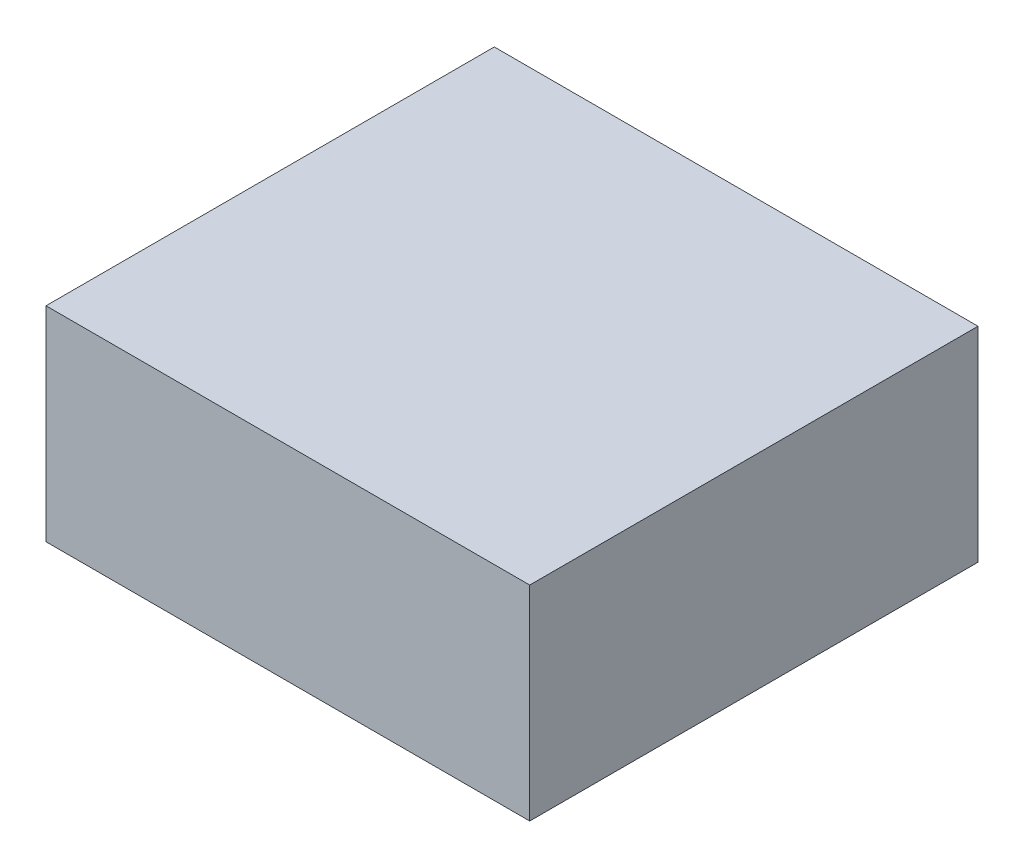
ISO-10303-21;
HEADER;
FILE_DESCRIPTION(('STEP AP214'),'2;1');
FILE_NAME('part.step','',(''),(''),'','','');
FILE_SCHEMA(('AUTOMOTIVE_DESIGN { 1 0 10303 214 1 1 1 1 }'));
ENDSEC;
DATA;
#1=APPLICATION_CONTEXT('core data for automotive mechanical design processes');
#2=APPLICATION_PROTOCOL_DEFINITION('international standard','automotive_design',2000,#1);
#3=PRODUCT_CONTEXT('',#1,'mechanical');
#4=PRODUCT('Part','Part','',(#3));
#5=PRODUCT_RELATED_PRODUCT_CATEGORY('part','',(#4));
#6=PRODUCT_DEFINITION_FORMATION('','',#4);
#7=PRODUCT_DEFINITION_CONTEXT('part definition',#1,'design');
#8=PRODUCT_DEFINITION('design','',#6,#7);
#9=PRODUCT_DEFINITION_SHAPE('','',#8);
#10=(LENGTH_UNIT() NAMED_UNIT(*) SI_UNIT(.MILLI.,.METRE.));
#11=(NAMED_UNIT(*) PLANE_ANGLE_UNIT() SI_UNIT($,.RADIAN.));
#12=(NAMED_UNIT(*) SI_UNIT($,.STERADIAN.) SOLID_ANGLE_UNIT());
#13=UNCERTAINTY_MEASURE_WITH_UNIT(LENGTH_MEASURE(1.E-05),#10,'distance_accuracy_value','');
#14=(GEOMETRIC_REPRESENTATION_CONTEXT(3) GLOBAL_UNCERTAINTY_ASSIGNED_CONTEXT((#13)) GLOBAL_UNIT_ASSIGNED_CONTEXT((#10,
#11,#12)) REPRESENTATION_CONTEXT('',''));
#15=CARTESIAN_POINT('',(0.,0.,0.));
#16=DIRECTION('',(0.,0.,1.));
#17=DIRECTION('',(1.,0.,0.));
#18=AXIS2_PLACEMENT_3D('',#15,#16,#17);
#19=CARTESIAN_POINT('',(0.,76.2,0.));
#20=DIRECTION('',(-1.,0.,0.));
#21=DIRECTION('',(0.,0.,1.));
#22=AXIS2_PLACEMENT_3D('',#19,#20,#21);
#23=PLANE('',#22);
#24=DIRECTION('',(0.,0.,-1.));
#25=VECTOR('',#24,1.);
#26=CARTESIAN_POINT('',(0.,0.,0.));
#27=LINE('',#26,#25);
#28=CARTESIAN_POINT('',(0.,0.,0.));
#29=VERTEX_POINT('',#28);
#30=CARTESIAN_POINT('',(0.,0.,-167.132));
#31=VERTEX_POINT('',#30);
#32=EDGE_CURVE('E97',#29,#31,#27,.T.);
#33=ORIENTED_EDGE('',*,*,#32,.T.);
#34=DIRECTION('',(0.,-1.,0.));
#35=VECTOR('',#34,1.);
#36=CARTESIAN_POINT('',(0.,76.2,-167.132));
#37=LINE('',#36,#35);
#38=CARTESIAN_POINT('',(0.,76.2,-167.132));
#39=VERTEX_POINT('',#38);
#40=EDGE_CURVE('E11',#39,#31,#37,.T.);
#41=ORIENTED_EDGE('',*,*,#40,.F.);
#42=DIRECTION('',(0.,0.,-1.));
#43=VECTOR('',#42,1.);
#44=CARTESIAN_POINT('',(0.,76.2,0.));
#45=LINE('',#44,#43);
#46=CARTESIAN_POINT('',(0.,76.2,0.));
#47=VERTEX_POINT('',#46);
#48=EDGE_CURVE('E85',#47,#39,#45,.T.);
#49=ORIENTED_EDGE('',*,*,#48,.F.);
#50=DIRECTION('',(0.,-1.,0.));
#51=VECTOR('',#50,1.);
#52=CARTESIAN_POINT('',(0.,76.2,0.));
#53=LINE('',#52,#51);
#54=EDGE_CURVE('E93',#47,#29,#53,.T.);
#55=ORIENTED_EDGE('',*,*,#54,.T.);
#56=EDGE_LOOP('',(#33,#41,#49,#55));
#57=FACE_BOUND('',#56,.T.);
#58=ADVANCED_FACE('F34',(#57),#23,.F.);
#59=CARTESIAN_POINT('',(0.,76.2,-167.132));
#60=DIRECTION('',(0.,0.,1.));
#61=DIRECTION('',(1.,0.,0.));
#62=AXIS2_PLACEMENT_3D('',#59,#60,#61);
#63=PLANE('',#62);
#64=DIRECTION('',(-1.,0.,0.));
#65=VECTOR('',#64,1.);
#66=CARTESIAN_POINT('',(0.,0.,-167.132));
#67=LINE('',#66,#65);
#68=CARTESIAN_POINT('',(-180.34,0.,-167.132));
#69=VERTEX_POINT('',#68);
#70=EDGE_CURVE('E89',#31,#69,#67,.T.);
#71=ORIENTED_EDGE('',*,*,#70,.T.);
#72=DIRECTION('',(0.,-1.,0.));
#73=VECTOR('',#72,1.);
#74=CARTESIAN_POINT('',(-180.34,76.2,-167.132));
#75=LINE('',#74,#73);
#76=CARTESIAN_POINT('',(-180.34,76.2,-167.132));
#77=VERTEX_POINT('',#76);
#78=EDGE_CURVE('E42',#77,#69,#75,.T.);
#79=ORIENTED_EDGE('',*,*,#78,.F.);
#80=DIRECTION('',(-1.,0.,0.));
#81=VECTOR('',#80,1.);
#82=CARTESIAN_POINT('',(0.,76.2,-167.132));
#83=LINE('',#82,#81);
#84=EDGE_CURVE('E80',#39,#77,#83,.T.);
#85=ORIENTED_EDGE('',*,*,#84,.F.);
#86=ORIENTED_EDGE('',*,*,#40,.T.);
#87=EDGE_LOOP('',(#71,#79,#85,#86));
#88=FACE_BOUND('',#87,.T.);
#89=ADVANCED_FACE('F88',(#88),#63,.F.);
#90=CARTESIAN_POINT('',(-180.34,76.2,0.));
#91=DIRECTION('',(1.,0.,0.));
#92=DIRECTION('',(0.,0.,-1.));
#93=AXIS2_PLACEMENT_3D('',#90,#91,#92);
#94=PLANE('',#93);
#95=DIRECTION('',(0.,0.,1.));
#96=VECTOR('',#95,1.);
#97=CARTESIAN_POINT('',(-180.34,0.,0.));
#98=LINE('',#97,#96);
#99=CARTESIAN_POINT('',(-180.34,0.,0.));
#100=VERTEX_POINT('',#99);
#101=EDGE_CURVE('E67',#69,#100,#98,.T.);
#102=ORIENTED_EDGE('',*,*,#101,.T.);
#103=DIRECTION('',(0.,-1.,0.));
#104=VECTOR('',#103,1.);
#105=CARTESIAN_POINT('',(-180.34,76.2,0.));
#106=LINE('',#105,#104);
#107=CARTESIAN_POINT('',(-180.34,76.2,0.));
#108=VERTEX_POINT('',#107);
#109=EDGE_CURVE('E90',#108,#100,#106,.T.);
#110=ORIENTED_EDGE('',*,*,#109,.F.);
#111=DIRECTION('',(0.,0.,1.));
#112=VECTOR('',#111,1.);
#113=CARTESIAN_POINT('',(-180.34,76.2,0.));
#114=LINE('',#113,#112);
#115=EDGE_CURVE('E83',#77,#108,#114,.T.);
#116=ORIENTED_EDGE('',*,*,#115,.F.);
#117=ORIENTED_EDGE('',*,*,#78,.T.);
#118=EDGE_LOOP('',(#102,#110,#116,#117));
#119=FACE_BOUND('',#118,.T.);
#120=ADVANCED_FACE('F91',(#119),#94,.F.);
#121=CARTESIAN_POINT('',(0.,76.2,0.));
#122=DIRECTION('',(0.,0.,-1.));
#123=DIRECTION('',(-1.,0.,0.));
#124=AXIS2_PLACEMENT_3D('',#121,#122,#123);
#125=PLANE('',#124);
#126=DIRECTION('',(1.,0.,0.));
#127=VECTOR('',#126,1.);
#128=CARTESIAN_POINT('',(0.,0.,0.));
#129=LINE('',#128,#127);
#130=EDGE_CURVE('E73',#100,#29,#129,.T.);
#131=ORIENTED_EDGE('',*,*,#130,.T.);
#132=ORIENTED_EDGE('',*,*,#54,.F.);
#133=DIRECTION('',(1.,0.,0.));
#134=VECTOR('',#133,1.);
#135=CARTESIAN_POINT('',(0.,76.2,0.));
#136=LINE('',#135,#134);
#137=EDGE_CURVE('E50',#108,#47,#136,.T.);
#138=ORIENTED_EDGE('',*,*,#137,.F.);
#139=ORIENTED_EDGE('',*,*,#109,.T.);
#140=EDGE_LOOP('',(#131,#132,#138,#139));
#141=FACE_BOUND('',#140,.T.);
#142=ADVANCED_FACE('F104',(#141),#125,.F.);
#143=CARTESIAN_POINT('',(0.,76.2,0.));
#144=DIRECTION('',(0.,1.,0.));
#145=DIRECTION('',(0.,0.,1.));
#146=AXIS2_PLACEMENT_3D('',#143,#144,#145);
#147=PLANE('',#146);
#148=ORIENTED_EDGE('',*,*,#48,.T.);
#149=ORIENTED_EDGE('',*,*,#84,.T.);
#150=ORIENTED_EDGE('',*,*,#115,.T.);
#151=ORIENTED_EDGE('',*,*,#137,.T.);
#152=EDGE_LOOP('',(#148,#149,#150,#151));
#153=FACE_BOUND('',#152,.T.);
#154=ADVANCED_FACE('F81',(#153),#147,.T.);
#155=CARTESIAN_POINT('',(0.,0.,0.));
#156=DIRECTION('',(0.,1.,0.));
#157=DIRECTION('',(0.,0.,1.));
#158=AXIS2_PLACEMENT_3D('',#155,#156,#157);
#159=PLANE('',#158);
#160=ORIENTED_EDGE('',*,*,#32,.F.);
#161=ORIENTED_EDGE('',*,*,#130,.F.);
#162=ORIENTED_EDGE('',*,*,#101,.F.);
#163=ORIENTED_EDGE('',*,*,#70,.F.);
#164=EDGE_LOOP('',(#160,#161,#162,#163));
#165=FACE_BOUND('',#164,.T.);
#166=ADVANCED_FACE('F107',(#165),#159,.F.);
#167=CLOSED_SHELL('',(#58,#89,#120,#142,#154,#166));
#168=MANIFOLD_SOLID_BREP('B2',#167);
#169=ADVANCED_BREP_SHAPE_REPRESENTATION('',(#18,#168),#14);
#170=SHAPE_DEFINITION_REPRESENTATION(#9,#169);
ENDSEC;
END-ISO-10303-21;
